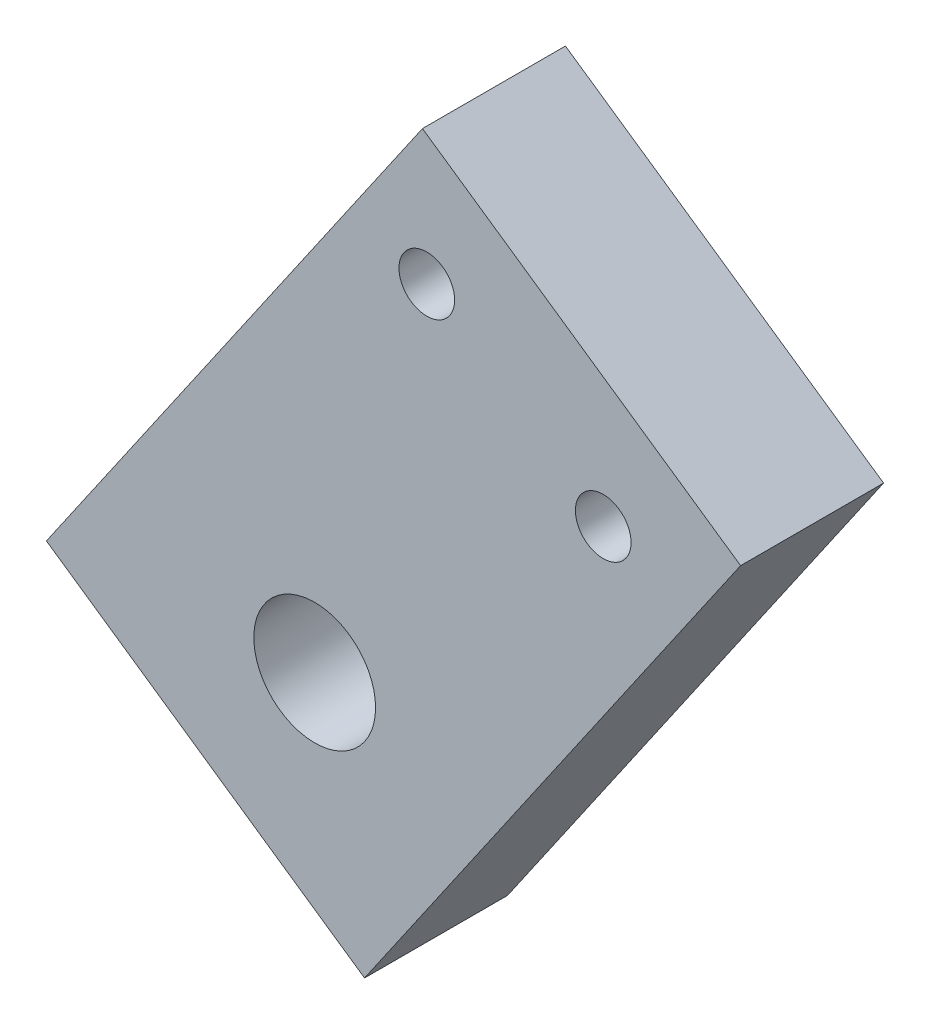
ISO-10303-21;
HEADER;
FILE_DESCRIPTION(('STEP AP214'),'2;1');
FILE_NAME('part.step','',(''),(''),'','','');
FILE_SCHEMA(('AUTOMOTIVE_DESIGN { 1 0 10303 214 1 1 1 1 }'));
ENDSEC;
DATA;
#1=APPLICATION_CONTEXT('core data for automotive mechanical design processes');
#2=APPLICATION_PROTOCOL_DEFINITION('international standard','automotive_design',2000,#1);
#3=PRODUCT_CONTEXT('',#1,'mechanical');
#4=PRODUCT('Part','Part','',(#3));
#5=PRODUCT_RELATED_PRODUCT_CATEGORY('part','',(#4));
#6=PRODUCT_DEFINITION_FORMATION('','',#4);
#7=PRODUCT_DEFINITION_CONTEXT('part definition',#1,'design');
#8=PRODUCT_DEFINITION('design','',#6,#7);
#9=PRODUCT_DEFINITION_SHAPE('','',#8);
#10=(LENGTH_UNIT() NAMED_UNIT(*) SI_UNIT(.MILLI.,.METRE.));
#11=(NAMED_UNIT(*) PLANE_ANGLE_UNIT() SI_UNIT($,.RADIAN.));
#12=(NAMED_UNIT(*) SI_UNIT($,.STERADIAN.) SOLID_ANGLE_UNIT());
#13=UNCERTAINTY_MEASURE_WITH_UNIT(LENGTH_MEASURE(1.E-05),#10,'distance_accuracy_value','');
#14=(GEOMETRIC_REPRESENTATION_CONTEXT(3) GLOBAL_UNCERTAINTY_ASSIGNED_CONTEXT((#13)) GLOBAL_UNIT_ASSIGNED_CONTEXT((#10,
#11,#12)) REPRESENTATION_CONTEXT('',''));
#15=CARTESIAN_POINT('',(0.,0.,0.));
#16=DIRECTION('',(0.,0.,1.));
#17=DIRECTION('',(1.,0.,0.));
#18=AXIS2_PLACEMENT_3D('',#15,#16,#17);
#19=CARTESIAN_POINT('',(-78.6688302859633,-120.640865940608,-9.398));
#20=DIRECTION('',(0.,0.,-1.));
#21=DIRECTION('',(1.,0.,0.));
#22=AXIS2_PLACEMENT_3D('',#19,#20,#21);
#23=PLANE('',#22);
#24=CARTESIAN_POINT('',(-74.5781091864287,-79.1004132197678,-9.398));
#25=DIRECTION('',(0.,0.,1.));
#26=DIRECTION('',(1.,0.,0.));
#27=AXIS2_PLACEMENT_3D('',#24,#25,#26);
#28=CIRCLE('',#27,1.8288);
#29=CARTESIAN_POINT('',(-72.7493091864287,-79.1004132197678,-9.398));
#30=VERTEX_POINT('',#29);
#31=EDGE_CURVE('E116',#30,#30,#28,.T.);
#32=ORIENTED_EDGE('',*,*,#31,.T.);
#33=EDGE_LOOP('',(#32));
#34=FACE_BOUND('',#33,.T.);
#35=DIRECTION('',(0.823144688267468,-0.56783168472449,0.));
#36=VECTOR('',#35,1.);
#37=CARTESIAN_POINT('',(-99.576705367957,-106.217941148606,-9.398));
#38=LINE('',#37,#36);
#39=CARTESIAN_POINT('',(-99.576705367957,-106.217941148606,-9.398));
#40=VERTEX_POINT('',#39);
#41=CARTESIAN_POINT('',(-78.6688302859633,-120.640865940608,-9.398));
#42=VERTEX_POINT('',#41);
#43=EDGE_CURVE('E93',#40,#42,#38,.T.);
#44=ORIENTED_EDGE('',*,*,#43,.F.);
#45=DIRECTION('',(-0.56783168472449,-0.823144688267468,0.));
#46=VECTOR('',#45,1.);
#47=CARTESIAN_POINT('',(-99.576705367957,-106.217941148606,-9.398));
#48=LINE('',#47,#46);
#49=CARTESIAN_POINT('',(-74.8622329882517,-70.3911509043131,-9.398));
#50=VERTEX_POINT('',#49);
#51=EDGE_CURVE('E96',#50,#40,#48,.T.);
#52=ORIENTED_EDGE('',*,*,#51,.F.);
#53=DIRECTION('',(-0.823144688267468,0.56783168472449,0.));
#54=VECTOR('',#53,1.);
#55=CARTESIAN_POINT('',(-74.8622329882517,-70.3911509043131,-9.398));
#56=LINE('',#55,#54);
#57=CARTESIAN_POINT('',(-53.954357906258,-84.8140756963151,-9.398));
#58=VERTEX_POINT('',#57);
#59=EDGE_CURVE('E84',#58,#50,#56,.T.);
#60=ORIENTED_EDGE('',*,*,#59,.F.);
#61=DIRECTION('',(0.56783168472449,0.823144688267468,0.));
#62=VECTOR('',#61,1.);
#63=CARTESIAN_POINT('',(-78.6688302859633,-120.640865940608,-9.398));
#64=LINE('',#63,#62);
#65=EDGE_CURVE('E89',#42,#58,#64,.T.);
#66=ORIENTED_EDGE('',*,*,#65,.F.);
#67=EDGE_LOOP('',(#44,#52,#60,#66));
#68=FACE_BOUND('',#67,.T.);
#69=CARTESIAN_POINT('',(-81.9449970294961,-104.896422338878,-9.398));
#70=DIRECTION('',(0.,0.,1.));
#71=DIRECTION('',(1.,0.,0.));
#72=AXIS2_PLACEMENT_3D('',#69,#70,#71);
#73=CIRCLE('',#72,4.00050000000001);
#74=CARTESIAN_POINT('',(-77.9444970294961,-104.896422338878,-9.398));
#75=VERTEX_POINT('',#74);
#76=EDGE_CURVE('E105',#75,#75,#73,.T.);
#77=ORIENTED_EDGE('',*,*,#76,.T.);
#78=EDGE_LOOP('',(#77));
#79=FACE_BOUND('',#78,.T.);
#80=CARTESIAN_POINT('',(-62.9827304491089,-87.0992784706499,-9.398));
#81=DIRECTION('',(0.,0.,1.));
#82=DIRECTION('',(1.,0.,0.));
#83=AXIS2_PLACEMENT_3D('',#80,#81,#82);
#84=CIRCLE('',#83,1.82879999999998);
#85=CARTESIAN_POINT('',(-61.1539304491089,-87.0992784706499,-9.398));
#86=VERTEX_POINT('',#85);
#87=EDGE_CURVE('E122',#86,#86,#84,.T.);
#88=ORIENTED_EDGE('',*,*,#87,.T.);
#89=EDGE_LOOP('',(#88));
#90=FACE_BOUND('',#89,.T.);
#91=ADVANCED_FACE('F37',(#34,#68,#79,#90),#23,.T.);
#92=CARTESIAN_POINT('',(-78.6688302859633,-120.640865940608,0.));
#93=DIRECTION('',(0.,0.,-1.));
#94=DIRECTION('',(1.,0.,0.));
#95=AXIS2_PLACEMENT_3D('',#92,#93,#94);
#96=PLANE('',#95);
#97=CARTESIAN_POINT('',(-74.5781091864287,-79.1004132197678,0.));
#98=DIRECTION('',(0.,0.,1.));
#99=DIRECTION('',(1.,0.,0.));
#100=AXIS2_PLACEMENT_3D('',#97,#98,#99);
#101=CIRCLE('',#100,1.8288);
#102=CARTESIAN_POINT('',(-72.7493091864287,-79.1004132197678,0.));
#103=VERTEX_POINT('',#102);
#104=EDGE_CURVE('E119',#103,#103,#101,.T.);
#105=ORIENTED_EDGE('',*,*,#104,.F.);
#106=EDGE_LOOP('',(#105));
#107=FACE_BOUND('',#106,.T.);
#108=DIRECTION('',(0.823144688267468,-0.56783168472449,0.));
#109=VECTOR('',#108,1.);
#110=CARTESIAN_POINT('',(-99.576705367957,-106.217941148606,0.));
#111=LINE('',#110,#109);
#112=CARTESIAN_POINT('',(-99.576705367957,-106.217941148606,0.));
#113=VERTEX_POINT('',#112);
#114=CARTESIAN_POINT('',(-78.6688302859633,-120.640865940608,0.));
#115=VERTEX_POINT('',#114);
#116=EDGE_CURVE('E101',#113,#115,#111,.T.);
#117=ORIENTED_EDGE('',*,*,#116,.T.);
#118=DIRECTION('',(0.56783168472449,0.823144688267468,0.));
#119=VECTOR('',#118,1.);
#120=CARTESIAN_POINT('',(-78.6688302859633,-120.640865940608,0.));
#121=LINE('',#120,#119);
#122=CARTESIAN_POINT('',(-53.954357906258,-84.8140756963151,0.));
#123=VERTEX_POINT('',#122);
#124=EDGE_CURVE('E104',#115,#123,#121,.T.);
#125=ORIENTED_EDGE('',*,*,#124,.T.);
#126=DIRECTION('',(-0.823144688267468,0.56783168472449,0.));
#127=VECTOR('',#126,1.);
#128=CARTESIAN_POINT('',(-74.8622329882517,-70.3911509043131,0.));
#129=LINE('',#128,#127);
#130=CARTESIAN_POINT('',(-74.8622329882517,-70.3911509043131,0.));
#131=VERTEX_POINT('',#130);
#132=EDGE_CURVE('E87',#123,#131,#129,.T.);
#133=ORIENTED_EDGE('',*,*,#132,.T.);
#134=DIRECTION('',(-0.56783168472449,-0.823144688267468,0.));
#135=VECTOR('',#134,1.);
#136=CARTESIAN_POINT('',(-99.576705367957,-106.217941148606,0.));
#137=LINE('',#136,#135);
#138=EDGE_CURVE('E108',#131,#113,#137,.T.);
#139=ORIENTED_EDGE('',*,*,#138,.T.);
#140=EDGE_LOOP('',(#117,#125,#133,#139));
#141=FACE_BOUND('',#140,.T.);
#142=CARTESIAN_POINT('',(-81.9449970294961,-104.896422338878,0.));
#143=DIRECTION('',(0.,0.,1.));
#144=DIRECTION('',(1.,0.,0.));
#145=AXIS2_PLACEMENT_3D('',#142,#143,#144);
#146=CIRCLE('',#145,4.00050000000001);
#147=CARTESIAN_POINT('',(-77.9444970294961,-104.896422338878,0.));
#148=VERTEX_POINT('',#147);
#149=EDGE_CURVE('E113',#148,#148,#146,.T.);
#150=ORIENTED_EDGE('',*,*,#149,.F.);
#151=EDGE_LOOP('',(#150));
#152=FACE_BOUND('',#151,.T.);
#153=CARTESIAN_POINT('',(-62.9827304491089,-87.0992784706499,0.));
#154=DIRECTION('',(0.,0.,1.));
#155=DIRECTION('',(1.,0.,0.));
#156=AXIS2_PLACEMENT_3D('',#153,#154,#155);
#157=CIRCLE('',#156,1.82879999999998);
#158=CARTESIAN_POINT('',(-61.1539304491089,-87.0992784706499,0.));
#159=VERTEX_POINT('',#158);
#160=EDGE_CURVE('E125',#159,#159,#157,.T.);
#161=ORIENTED_EDGE('',*,*,#160,.F.);
#162=EDGE_LOOP('',(#161));
#163=FACE_BOUND('',#162,.T.);
#164=ADVANCED_FACE('F139',(#107,#141,#152,#163),#96,.F.);
#165=CARTESIAN_POINT('',(-99.576705367957,-106.217941148606,-9.398));
#166=DIRECTION('',(0.56783168472449,0.823144688267468,0.));
#167=DIRECTION('',(-0.823144688267468,0.56783168472449,0.));
#168=AXIS2_PLACEMENT_3D('',#165,#166,#167);
#169=PLANE('',#168);
#170=ORIENTED_EDGE('',*,*,#116,.F.);
#171=DIRECTION('',(0.,0.,1.));
#172=VECTOR('',#171,1.);
#173=CARTESIAN_POINT('',(-99.576705367957,-106.217941148606,-9.398));
#174=LINE('',#173,#172);
#175=EDGE_CURVE('E54',#40,#113,#174,.T.);
#176=ORIENTED_EDGE('',*,*,#175,.F.);
#177=ORIENTED_EDGE('',*,*,#43,.T.);
#178=DIRECTION('',(0.,0.,1.));
#179=VECTOR('',#178,1.);
#180=CARTESIAN_POINT('',(-78.6688302859633,-120.640865940608,-9.398));
#181=LINE('',#180,#179);
#182=EDGE_CURVE('E11',#42,#115,#181,.T.);
#183=ORIENTED_EDGE('',*,*,#182,.T.);
#184=EDGE_LOOP('',(#170,#176,#177,#183));
#185=FACE_BOUND('',#184,.T.);
#186=ADVANCED_FACE('F39',(#185),#169,.F.);
#187=CARTESIAN_POINT('',(-78.6688302859633,-120.640865940608,-9.398));
#188=DIRECTION('',(-0.823144688267468,0.56783168472449,0.));
#189=DIRECTION('',(-0.56783168472449,-0.823144688267468,0.));
#190=AXIS2_PLACEMENT_3D('',#187,#188,#189);
#191=PLANE('',#190);
#192=ORIENTED_EDGE('',*,*,#124,.F.);
#193=ORIENTED_EDGE('',*,*,#182,.F.);
#194=ORIENTED_EDGE('',*,*,#65,.T.);
#195=DIRECTION('',(0.,0.,1.));
#196=VECTOR('',#195,1.);
#197=CARTESIAN_POINT('',(-53.954357906258,-84.8140756963151,-9.398));
#198=LINE('',#197,#196);
#199=EDGE_CURVE('E46',#58,#123,#198,.T.);
#200=ORIENTED_EDGE('',*,*,#199,.T.);
#201=EDGE_LOOP('',(#192,#193,#194,#200));
#202=FACE_BOUND('',#201,.T.);
#203=ADVANCED_FACE('F90',(#202),#191,.F.);
#204=CARTESIAN_POINT('',(-74.8622329882517,-70.3911509043131,-9.398));
#205=DIRECTION('',(-0.56783168472449,-0.823144688267468,0.));
#206=DIRECTION('',(0.823144688267468,-0.56783168472449,0.));
#207=AXIS2_PLACEMENT_3D('',#204,#205,#206);
#208=PLANE('',#207);
#209=ORIENTED_EDGE('',*,*,#132,.F.);
#210=ORIENTED_EDGE('',*,*,#199,.F.);
#211=ORIENTED_EDGE('',*,*,#59,.T.);
#212=DIRECTION('',(0.,0.,1.));
#213=VECTOR('',#212,1.);
#214=CARTESIAN_POINT('',(-74.8622329882517,-70.3911509043131,-9.398));
#215=LINE('',#214,#213);
#216=EDGE_CURVE('E70',#50,#131,#215,.T.);
#217=ORIENTED_EDGE('',*,*,#216,.T.);
#218=EDGE_LOOP('',(#209,#210,#211,#217));
#219=FACE_BOUND('',#218,.T.);
#220=ADVANCED_FACE('F82',(#219),#208,.F.);
#221=CARTESIAN_POINT('',(-99.576705367957,-106.217941148606,-9.398));
#222=DIRECTION('',(0.823144688267468,-0.56783168472449,0.));
#223=DIRECTION('',(0.56783168472449,0.823144688267468,0.));
#224=AXIS2_PLACEMENT_3D('',#221,#222,#223);
#225=PLANE('',#224);
#226=ORIENTED_EDGE('',*,*,#138,.F.);
#227=ORIENTED_EDGE('',*,*,#216,.F.);
#228=ORIENTED_EDGE('',*,*,#51,.T.);
#229=ORIENTED_EDGE('',*,*,#175,.T.);
#230=EDGE_LOOP('',(#226,#227,#228,#229));
#231=FACE_BOUND('',#230,.T.);
#232=ADVANCED_FACE('F152',(#231),#225,.F.);
#233=CARTESIAN_POINT('',(-81.9449970294961,-104.896422338878,-9.398));
#234=DIRECTION('',(0.,0.,1.));
#235=DIRECTION('',(-1.,0.,0.));
#236=AXIS2_PLACEMENT_3D('',#233,#234,#235);
#237=CYLINDRICAL_SURFACE('',#236,4.00050000000001);
#238=ORIENTED_EDGE('',*,*,#76,.F.);
#239=EDGE_LOOP('',(#238));
#240=FACE_BOUND('',#239,.T.);
#241=ORIENTED_EDGE('',*,*,#149,.T.);
#242=EDGE_LOOP('',(#241));
#243=FACE_BOUND('',#242,.T.);
#244=ADVANCED_FACE('F155',(#240,#243),#237,.F.);
#245=CARTESIAN_POINT('',(-74.5781091864287,-79.1004132197678,-9.398));
#246=DIRECTION('',(0.,0.,1.));
#247=DIRECTION('',(-1.,0.,0.));
#248=AXIS2_PLACEMENT_3D('',#245,#246,#247);
#249=CYLINDRICAL_SURFACE('',#248,1.8288);
#250=ORIENTED_EDGE('',*,*,#31,.F.);
#251=EDGE_LOOP('',(#250));
#252=FACE_BOUND('',#251,.T.);
#253=ORIENTED_EDGE('',*,*,#104,.T.);
#254=EDGE_LOOP('',(#253));
#255=FACE_BOUND('',#254,.T.);
#256=ADVANCED_FACE('F135',(#252,#255),#249,.F.);
#257=CARTESIAN_POINT('',(-62.9827304491089,-87.0992784706499,-9.398));
#258=DIRECTION('',(0.,0.,1.));
#259=DIRECTION('',(-1.,0.,0.));
#260=AXIS2_PLACEMENT_3D('',#257,#258,#259);
#261=CYLINDRICAL_SURFACE('',#260,1.82879999999998);
#262=ORIENTED_EDGE('',*,*,#87,.F.);
#263=EDGE_LOOP('',(#262));
#264=FACE_BOUND('',#263,.T.);
#265=ORIENTED_EDGE('',*,*,#160,.T.);
#266=EDGE_LOOP('',(#265));
#267=FACE_BOUND('',#266,.T.);
#268=ADVANCED_FACE('F132',(#264,#267),#261,.F.);
#269=CLOSED_SHELL('',(#91,#164,#186,#203,#220,#232,#244,#256,#268));
#270=MANIFOLD_SOLID_BREP('B2',#269);
#271=ADVANCED_BREP_SHAPE_REPRESENTATION('',(#18,#270),#14);
#272=SHAPE_DEFINITION_REPRESENTATION(#9,#271);
ENDSEC;
END-ISO-10303-21;
